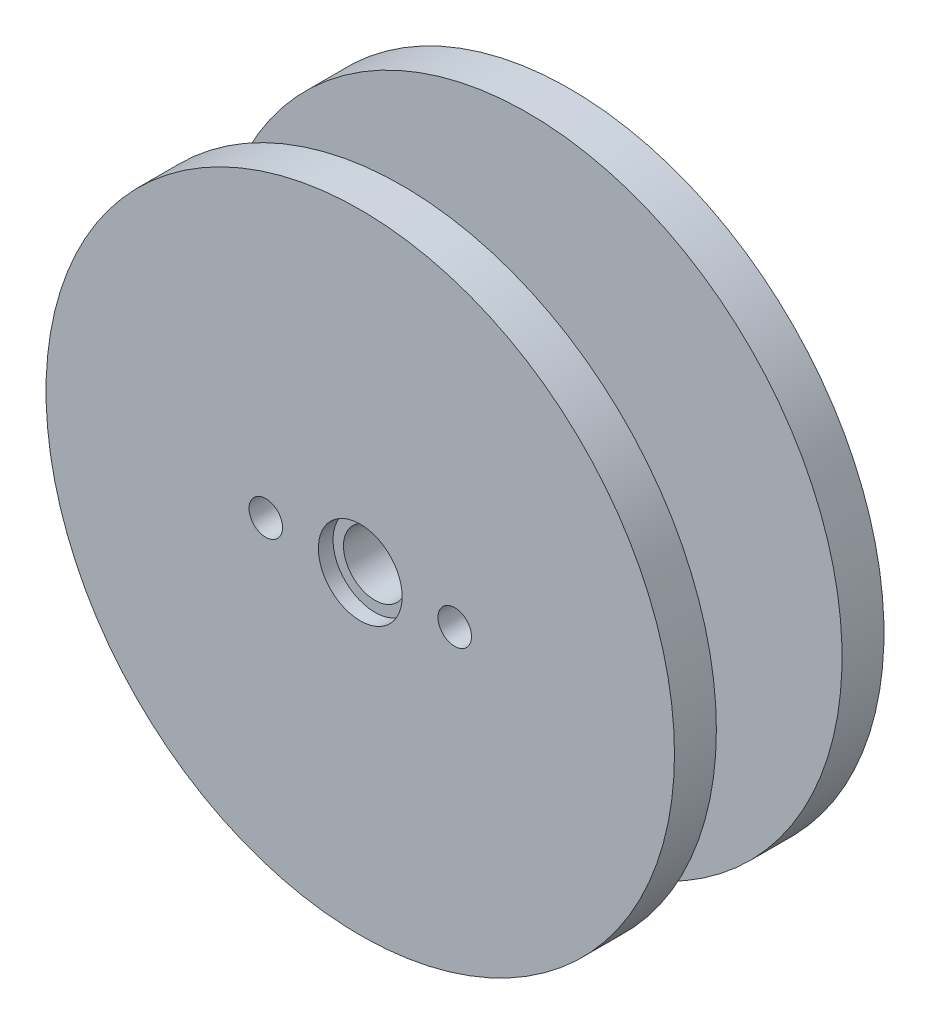
ISO-10303-21;
HEADER;
FILE_DESCRIPTION(('STEP AP214'),'2;1');
FILE_NAME('part.step','',(''),(''),'','','');
FILE_SCHEMA(('AUTOMOTIVE_DESIGN { 1 0 10303 214 1 1 1 1 }'));
ENDSEC;
DATA;
#1=APPLICATION_CONTEXT('core data for automotive mechanical design processes');
#2=APPLICATION_PROTOCOL_DEFINITION('international standard','automotive_design',2000,#1);
#3=PRODUCT_CONTEXT('',#1,'mechanical');
#4=PRODUCT('Part','Part','',(#3));
#5=PRODUCT_RELATED_PRODUCT_CATEGORY('part','',(#4));
#6=PRODUCT_DEFINITION_FORMATION('','',#4);
#7=PRODUCT_DEFINITION_CONTEXT('part definition',#1,'design');
#8=PRODUCT_DEFINITION('design','',#6,#7);
#9=PRODUCT_DEFINITION_SHAPE('','',#8);
#10=(LENGTH_UNIT() NAMED_UNIT(*) SI_UNIT(.MILLI.,.METRE.));
#11=(NAMED_UNIT(*) PLANE_ANGLE_UNIT() SI_UNIT($,.RADIAN.));
#12=(NAMED_UNIT(*) SI_UNIT($,.STERADIAN.) SOLID_ANGLE_UNIT());
#13=UNCERTAINTY_MEASURE_WITH_UNIT(LENGTH_MEASURE(1.E-05),#10,'distance_accuracy_value','');
#14=(GEOMETRIC_REPRESENTATION_CONTEXT(3) GLOBAL_UNCERTAINTY_ASSIGNED_CONTEXT((#13)) GLOBAL_UNIT_ASSIGNED_CONTEXT((#10,
#11,#12)) REPRESENTATION_CONTEXT('',''));
#15=CARTESIAN_POINT('',(0.,0.,0.));
#16=DIRECTION('',(0.,0.,1.));
#17=DIRECTION('',(1.,0.,0.));
#18=AXIS2_PLACEMENT_3D('',#15,#16,#17);
#19=CARTESIAN_POINT('',(0.,0.,8.));
#20=DIRECTION('',(0.,0.,-1.));
#21=DIRECTION('',(-1.,0.,0.));
#22=AXIS2_PLACEMENT_3D('',#19,#20,#21);
#23=CYLINDRICAL_SURFACE('',#22,1.5);
#24=CARTESIAN_POINT('',(0.,0.,-2.));
#25=DIRECTION('',(0.,0.,-1.));
#26=DIRECTION('',(-1.,0.,0.));
#27=AXIS2_PLACEMENT_3D('',#24,#25,#26);
#28=CIRCLE('',#27,1.5);
#29=CARTESIAN_POINT('',(-1.5,0.,-2.));
#30=VERTEX_POINT('',#29);
#31=EDGE_CURVE('E66',#30,#30,#28,.T.);
#32=ORIENTED_EDGE('',*,*,#31,.T.);
#33=EDGE_LOOP('',(#32));
#34=FACE_BOUND('',#33,.T.);
#35=CARTESIAN_POINT('',(0.,0.,7.3));
#36=DIRECTION('',(0.,0.,1.));
#37=DIRECTION('',(1.,0.,0.));
#38=AXIS2_PLACEMENT_3D('',#35,#36,#37);
#39=CIRCLE('',#38,1.5);
#40=CARTESIAN_POINT('',(1.5,0.,7.3));
#41=VERTEX_POINT('',#40);
#42=EDGE_CURVE('E43',#41,#41,#39,.F.);
#43=ORIENTED_EDGE('',*,*,#42,.F.);
#44=EDGE_LOOP('',(#43));
#45=FACE_BOUND('',#44,.T.);
#46=ADVANCED_FACE('F38',(#34,#45),#23,.F.);
#47=CARTESIAN_POINT('',(0.,0.,3.));
#48=DIRECTION('',(0.,0.,1.));
#49=DIRECTION('',(1.,0.,0.));
#50=AXIS2_PLACEMENT_3D('',#47,#48,#49);
#51=TOROIDAL_SURFACE('',#50,5.5,3.);
#52=CARTESIAN_POINT('',(3.84590634261577,-0.447005305401507,5.51971305273532));
#53=CARTESIAN_POINT('',(3.8736657957954,-0.488206800975002,5.54060192491901));
#54=CARTESIAN_POINT('',(3.90493997473341,-0.526352777900137,5.56298081347047));
#55=CARTESIAN_POINT('',(3.97361066421637,-0.596126887451473,5.60876043869469));
#56=CARTESIAN_POINT('',(4.01102750979954,-0.627732555291743,5.63216437337878));
#57=CARTESIAN_POINT('',(4.09114575943373,-0.683716747534394,5.6784516763839));
#58=CARTESIAN_POINT('',(4.13384019268729,-0.708104663772777,5.7013356851022));
#59=CARTESIAN_POINT('',(4.22364112865989,-0.748855362876252,5.74543973880093));
#60=CARTESIAN_POINT('',(4.27074222054837,-0.765227837589809,5.76666176713467));
#61=CARTESIAN_POINT('',(4.36735794436639,-0.788835080549227,5.80624577416201));
#62=CARTESIAN_POINT('',(4.41681749335596,-0.796221398309971,5.82465047462435));
#63=CARTESIAN_POINT('',(4.5172666641873,-0.801537289848154,5.85844466005841));
#64=CARTESIAN_POINT('',(4.5682555443175,-0.799471376486522,5.87383558026599));
#65=CARTESIAN_POINT('',(4.66469282239618,-0.786133156007755,5.89998092206338));
#66=CARTESIAN_POINT('',(4.7101879542234,-0.775796797946422,5.91104421286877));
#67=CARTESIAN_POINT('',(4.79916882584744,-0.747127520136588,5.93057884861724));
#68=CARTESIAN_POINT('',(4.84265532276102,-0.728797641049508,5.93905117705565));
#69=CARTESIAN_POINT('',(4.92348175134706,-0.685914554423775,5.95321014804157));
#70=CARTESIAN_POINT('',(4.96103451357555,-0.661806246675306,5.95903458385347));
#71=CARTESIAN_POINT('',(5.03174506827459,-0.607545338842571,5.96893431921367));
#72=CARTESIAN_POINT('',(5.06490325034442,-0.577393275160692,5.97300977388881));
#73=CARTESIAN_POINT('',(5.12545589320538,-0.512247345021257,5.97973524598194));
#74=CARTESIAN_POINT('',(5.15290818354631,-0.477308688041868,5.98240003680366));
#75=CARTESIAN_POINT('',(5.20167895474551,-0.403328247570261,5.9867118679521));
#76=CARTESIAN_POINT('',(5.22299724570435,-0.364286337098531,5.98835887677162));
#77=CARTESIAN_POINT('',(5.25900348307997,-0.282921492316378,5.99093528820772));
#78=CARTESIAN_POINT('',(5.27364619188831,-0.240578384652845,5.99185982418838));
#79=CARTESIAN_POINT('',(5.29567106874993,-0.154036101922157,5.99318832147928));
#80=CARTESIAN_POINT('',(5.30305302883622,-0.109836873728622,5.99359226787857));
#81=CARTESIAN_POINT('',(5.31036401942534,-0.0206080905449987,5.99399261612088));
#82=CARTESIAN_POINT('',(5.31025677885737,0.0244244492216642,5.99398703456575));
#83=CARTESIAN_POINT('',(5.30250182704995,0.113834042614353,5.99356177554952));
#84=CARTESIAN_POINT('',(5.294854009545,0.158211086993873,5.99314209225269));
#85=CARTESIAN_POINT('',(5.2722273647608,0.245087076993612,5.99177088723134));
#86=CARTESIAN_POINT('',(5.25724239408749,0.287584416168563,5.99081891973058));
#87=CARTESIAN_POINT('',(5.22037314074514,0.369448300672347,5.98816032004576));
#88=CARTESIAN_POINT('',(5.19848890417183,0.408814866916457,5.98645369290376));
#89=CARTESIAN_POINT('',(5.14852822322437,0.48319904717897,5.98198513651752));
#90=CARTESIAN_POINT('',(5.12046653098194,0.518226716468673,5.97922571010121));
#91=CARTESIAN_POINT('',(5.05897451706233,0.583036597984468,5.97229781042599));
#92=CARTESIAN_POINT('',(5.02554456741038,0.612819173400795,5.96812943478646));
#93=CARTESIAN_POINT('',(4.95460803053221,0.666122724410597,5.95805967229898));
#94=CARTESIAN_POINT('',(4.91713059986848,0.689684759038145,5.9521702190737));
#95=CARTESIAN_POINT('',(4.83911468194933,0.730206406578141,5.93834593502795));
#96=CARTESIAN_POINT('',(4.7985764747645,0.747166622705471,5.93041129118881));
#97=CARTESIAN_POINT('',(4.71585044593173,0.774115016239555,5.91232256270147));
#98=CARTESIAN_POINT('',(4.67366741578304,0.784122049144866,5.90217457923738));
#99=CARTESIAN_POINT('',(4.58884671101613,0.797198859420019,5.87959664166633));
#100=CARTESIAN_POINT('',(4.54620899570448,0.800268010537971,5.86716648166688));
#101=CARTESIAN_POINT('',(4.46058352480771,0.799687740500946,5.83978902872421));
#102=CARTESIAN_POINT('',(4.41761546797994,0.79586164754522,5.82478471645772));
#103=CARTESIAN_POINT('',(4.33356389362078,0.781607688319427,5.79279991739771));
#104=CARTESIAN_POINT('',(4.29248078349526,0.771178401999713,5.77581900616799));
#105=CARTESIAN_POINT('',(4.21012159194872,0.743287873175992,5.7390272230306));
#106=CARTESIAN_POINT('',(4.16905428461722,0.725365169122906,5.71910002670496));
#107=CARTESIAN_POINT('',(4.09082097306606,0.683222492861921,5.67821319994903));
#108=CARTESIAN_POINT('',(4.05365866798119,0.658996623949805,5.65725261773307));
#109=CARTESIAN_POINT('',(3.98046132356736,0.602167743110023,5.61318209891638));
#110=CARTESIAN_POINT('',(3.94488572932509,0.568979895461213,5.59006099431035));
#111=CARTESIAN_POINT('',(3.87993465202862,0.496171698215627,5.54523782055409));
#112=CARTESIAN_POINT('',(3.8505555591567,0.4565551176601,5.52353493032727));
#113=CARTESIAN_POINT('',(3.80517305169282,0.381497815482867,5.48841855774988));
#114=CARTESIAN_POINT('',(3.78765103914619,0.347322576068484,5.47426367876685));
#115=CARTESIAN_POINT('',(3.75742243243851,0.275812293621728,5.44918265271952));
#116=CARTESIAN_POINT('',(3.74470727187317,0.238483018174353,5.43825076960768));
#117=CARTESIAN_POINT('',(3.72633804884,0.167310601356769,5.4222090585503));
#118=CARTESIAN_POINT('',(3.71989778932614,0.133816765135987,5.41646162870088));
#119=CARTESIAN_POINT('',(3.71135328133478,0.0658535142941662,5.40880173737713));
#120=CARTESIAN_POINT('',(3.70924565825473,0.0313848801542608,5.40688629127968));
#121=CARTESIAN_POINT('',(3.70950958886731,-0.0375513562851095,5.40712496494974));
#122=CARTESIAN_POINT('',(3.71188530138707,-0.0720189279383176,5.40928286322924));
#123=CARTESIAN_POINT('',(3.72095900498777,-0.139934323434069,5.41740820443054));
#124=CARTESIAN_POINT('',(3.72766130563741,-0.173381095666829,5.42337944563115));
#125=CARTESIAN_POINT('',(3.74501955081187,-0.238554264204807,5.43850589277525));
#126=CARTESIAN_POINT('',(3.75568679713242,-0.270275442627187,5.44767019559324));
#127=CARTESIAN_POINT('',(3.78051049916783,-0.331436411570226,5.46838927771473));
#128=CARTESIAN_POINT('',(3.79466386903667,-0.360878189639608,5.47994194144422));
#129=CARTESIAN_POINT('',(3.82145226665705,-0.409008611633465,5.50107398233102));
#130=CARTESIAN_POINT('',(3.83331790889555,-0.428321137062714,5.51024030911631));
#131=CARTESIAN_POINT('',(3.84590634261577,-0.447005305401507,5.51971305273532));
#132=B_SPLINE_CURVE_WITH_KNOTS('',3,(#52,#53,#54,#55,#56,#57,#58,#59,#60,#61,#62,#63,#64,#65,
#66,#67,#68,#69,#70,#71,#72,#73,#74,#75,#76,#77,#78,#79,#80,#81,#82,#83,#84,#85,#86,#87,#88,#89,
#90,#91,#92,#93,#94,#95,#96,#97,#98,#99,#100,#101,#102,#103,#104,#105,#106,#107,#108,#109,#110,
#111,#112,#113,#114,#115,#116,#117,#118,#119,#120,#121,#122,#123,#124,#125,#126,#127,#128,#129,
#130,#131),.UNSPECIFIED.,.T.,.F.,(4,2,2,2,2,2,2,2,2,2,2,2,2,2,2,2,2,2,2,2,2,2,2,2,2,2,2,2,2,2,2,
2,2,2,2,2,2,2,2,4),(0.,0.161600596043769,0.323747370555806,0.485682220371078,0.647420780524826,
0.806392061163768,0.96528745068355,1.10838167364714,1.25142151230716,1.3857854787599,
1.52013752526328,1.6530532272666,1.78597304369845,1.91978068057509,2.05359214994371,
2.18805172857219,2.32251320209768,2.45708745316039,2.59166080511783,2.72591620837891,
2.86016231162732,2.99349881195332,3.12682312632603,3.25978446850146,3.39275781202972,
3.52918680326382,3.6656451442028,3.81215686473554,3.95880614509003,4.1196881468866,
4.28047616522288,4.40282959756593,4.52496394138022,4.62827635933461,4.73150827880897,
4.83483600524232,4.93826681208395,5.04199473068361,5.14563115933597,5.21891424525564),.UNSPECIFIED.);
#133=CARTESIAN_POINT('',(3.84590634261577,-0.447005305401507,5.51971305273532));
#134=VERTEX_POINT('',#133);
#135=EDGE_CURVE('E75',#134,#134,#132,.T.);
#136=ORIENTED_EDGE('',*,*,#135,.T.);
#137=EDGE_LOOP('',(#136));
#138=FACE_BOUND('',#137,.T.);
#139=CARTESIAN_POINT('',(-5.06228618167669,-0.578174330453134,5.9725635555975));
#140=CARTESIAN_POINT('',(-5.03030500488935,-0.608752404973662,5.96870893865694));
#141=CARTESIAN_POINT('',(-4.99579362410612,-0.636659657368072,5.96410535080206));
#142=CARTESIAN_POINT('',(-4.92278200037975,-0.686330111290471,5.95305605506126));
#143=CARTESIAN_POINT('',(-4.88427333513377,-0.708079964683237,5.94660640515561));
#144=CARTESIAN_POINT('',(-4.80459349550698,-0.744825588460931,5.93159618420919));
#145=CARTESIAN_POINT('',(-4.7634255121407,-0.759829287751273,5.92303810966462));
#146=CARTESIAN_POINT('',(-4.67972684535911,-0.78285571133062,5.90365311765589));
#147=CARTESIAN_POINT('',(-4.63719683475282,-0.790881828867673,5.8928273061907));
#148=CARTESIAN_POINT('',(-4.55163462060293,-0.800051926965312,5.86878560900146));
#149=CARTESIAN_POINT('',(-4.50860151586213,-0.801129092851337,5.85554777426391));
#150=CARTESIAN_POINT('',(-4.42363076209671,-0.796530393154323,5.82692390376569));
#151=CARTESIAN_POINT('',(-4.38169341922979,-0.790852660431337,5.81153727508884));
#152=CARTESIAN_POINT('',(-4.29759489325126,-0.772725253678213,5.7780298084748));
#153=CARTESIAN_POINT('',(-4.25555472311551,-0.759911381130719,5.75980365303739));
#154=CARTESIAN_POINT('',(-4.17467428365921,-0.727922901849148,5.72188509079244));
#155=CARTESIAN_POINT('',(-4.13583582963184,-0.708744717255481,5.70219186407392));
#156=CARTESIAN_POINT('',(-4.05846086925881,-0.662497430798277,5.66012383826044));
#157=CARTESIAN_POINT('',(-4.02031307505196,-0.63484657822345,5.63767335540682));
#158=CARTESIAN_POINT('',(-3.94932099486244,-0.573197167237218,5.59303905268779));
#159=CARTESIAN_POINT('',(-3.91647859629708,-0.539196359036044,5.57085533030986));
#160=CARTESIAN_POINT('',(-3.86048492434741,-0.469771547302976,5.53090361827071));
#161=CARTESIAN_POINT('',(-3.83664008763688,-0.435027661015909,5.51292713480073));
#162=CARTESIAN_POINT('',(-3.79430265281812,-0.361219439878678,5.47975689479346));
#163=CARTESIAN_POINT('',(-3.77580154359225,-0.322162113896519,5.46455872748172));
#164=CARTESIAN_POINT('',(-3.74826308210462,-0.248818722116708,5.44133470198051));
#165=CARTESIAN_POINT('',(-3.73805617652488,-0.215240026643889,5.43247380896978));
#166=CARTESIAN_POINT('',(-3.7220713461152,-0.146307570385357,5.41842462207925));
#167=CARTESIAN_POINT('',(-3.71628843248698,-0.110955857074749,5.41323219189494));
#168=CARTESIAN_POINT('',(-3.70951973345738,-0.03923559456745,5.40714193328157));
#169=CARTESIAN_POINT('',(-3.70855787783206,-0.00286287243102346,5.40626552822484));
#170=CARTESIAN_POINT('',(-3.71157407329029,0.0695078185921197,5.40899017211841));
#171=CARTESIAN_POINT('',(-3.71555312756685,0.105505709877265,5.41259213034732));
#172=CARTESIAN_POINT('',(-3.72771058883791,0.173545757594184,5.42339741122221));
#173=CARTESIAN_POINT('',(-3.73557741786207,0.205688847444054,5.43033260640786));
#174=CARTESIAN_POINT('',(-3.75492521281088,0.268104632378489,5.44698981948681));
#175=CARTESIAN_POINT('',(-3.7664088059629,0.298375948618029,5.45671386274658));
#176=CARTESIAN_POINT('',(-3.79828092777594,0.369397538980454,5.4829102341097));
#177=CARTESIAN_POINT('',(-3.82037038373876,0.408981922926679,5.50047844954565));
#178=CARTESIAN_POINT('',(-3.87018671674688,0.483162273240104,5.53800232042236));
#179=CARTESIAN_POINT('',(-3.89792266927207,0.517750053723196,5.55796179775715));
#180=CARTESIAN_POINT('',(-3.95880171855604,0.582119156957181,5.59912809598338));
#181=CARTESIAN_POINT('',(-3.99202040929109,0.611819669650258,5.62034923885603));
#182=CARTESIAN_POINT('',(-4.06297608479665,0.665361590007413,5.6625960004649));
#183=CARTESIAN_POINT('',(-4.10071220980098,0.689204109946879,5.6836216555884));
#184=CARTESIAN_POINT('',(-4.18471177870381,0.732860887846886,5.72694017260616));
#185=CARTESIAN_POINT('',(-4.2314567330724,0.751892555377657,5.74909918750791));
#186=CARTESIAN_POINT('',(-4.32868916830052,0.780976770951903,5.7910277710986));
#187=CARTESIAN_POINT('',(-4.37917572079463,0.791031538319655,5.81079792932966));
#188=CARTESIAN_POINT('',(-4.47867971311452,0.800862907958791,5.84597366643121));
#189=CARTESIAN_POINT('',(-4.52755742184901,0.801302017175522,5.8615864932043));
#190=CARTESIAN_POINT('',(-4.62540727709802,0.793058243187125,5.88981293636591));
#191=CARTESIAN_POINT('',(-4.67437934044746,0.784381354175199,5.90242851689928));
#192=CARTESIAN_POINT('',(-4.76599096593649,0.759073140680511,5.92361940285686));
#193=CARTESIAN_POINT('',(-4.80879563858762,0.743257494786835,5.93246149554266));
#194=CARTESIAN_POINT('',(-4.89141048848561,0.704364176847662,5.94786621045081));
#195=CARTESIAN_POINT('',(-4.9312213378526,0.681288140843013,5.95442934550841));
#196=CARTESIAN_POINT('',(-5.0049888188098,0.629535198682406,5.96537701298052));
#197=CARTESIAN_POINT('',(-5.03911387866926,0.601113626034073,5.96983693324609));
#198=CARTESIAN_POINT('',(-5.10226855888959,0.538922124256695,5.97729576815299));
#199=CARTESIAN_POINT('',(-5.1312983241045,0.505152347223582,5.98029472433234));
#200=CARTESIAN_POINT('',(-5.18336843682701,0.4332412542951,5.98518022629812));
#201=CARTESIAN_POINT('',(-5.20641291226416,0.395102977562005,5.98706753990624));
#202=CARTESIAN_POINT('',(-5.24586888170413,0.315507725717116,5.99004324232946));
#203=CARTESIAN_POINT('',(-5.26228006251573,0.274050594016169,5.99113159342349));
#204=CARTESIAN_POINT('',(-5.28809169350862,0.188674562583849,5.99275110810765));
#205=CARTESIAN_POINT('',(-5.29744134272203,0.144740223120218,5.99327824519047));
#206=CARTESIAN_POINT('',(-5.3086685270725,0.0559276075666258,5.99390325303014));
#207=CARTESIAN_POINT('',(-5.31054656575625,0.0110493952935946,5.99400115271535));
#208=CARTESIAN_POINT('',(-5.30677352707496,-0.0785213302615419,5.99379644947503));
#209=CARTESIAN_POINT('',(-5.30110024152008,-0.123212906316586,5.99349266522794));
#210=CARTESIAN_POINT('',(-5.28234131243765,-0.211031878645072,5.9923946826854));
#211=CARTESIAN_POINT('',(-5.26925189169272,-0.25415846591237,5.99160023446431));
#212=CARTESIAN_POINT('',(-5.23603197924498,-0.337616259646348,5.98932419687911));
#213=CARTESIAN_POINT('',(-5.21589688162421,-0.37794561678557,5.98784215781431));
#214=CARTESIAN_POINT('',(-5.16920871202613,-0.454553204881142,5.98390503877159));
#215=CARTESIAN_POINT('',(-5.1426704970646,-0.490840533649168,5.98145220299632));
#216=CARTESIAN_POINT('',(-5.09716124277091,-0.543247096914741,5.97662894434535));
#217=CARTESIAN_POINT('',(-5.08011697040832,-0.561125827509628,5.97471265913943));
#218=CARTESIAN_POINT('',(-5.06228618167669,-0.578174330453134,5.9725635555975));
#219=B_SPLINE_CURVE_WITH_KNOTS('',3,(#139,#140,#141,#142,#143,#144,#145,#146,#147,#148,#149,
#150,#151,#152,#153,#154,#155,#156,#157,#158,#159,#160,#161,#162,#163,#164,#165,#166,#167,#168,
#169,#170,#171,#172,#173,#174,#175,#176,#177,#178,#179,#180,#181,#182,#183,#184,#185,#186,#187,
#188,#189,#190,#191,#192,#193,#194,#195,#196,#197,#198,#199,#200,#201,#202,#203,#204,#205,#206,
#207,#208,#209,#210,#211,#212,#213,#214,#215,#216,#217,#218),.UNSPECIFIED.,.T.,.F.,(4,2,2,2,2,2,
2,2,2,2,2,2,2,2,2,2,2,2,2,2,2,2,2,2,2,2,2,2,2,2,2,2,2,2,2,2,2,2,2,4),(0.,0.133168340433744,
0.266623193156662,0.399920780761347,0.53315350847354,0.667665392931658,0.802214466826629,
0.94435916750027,1.08658391418243,1.2424950096937,1.39846144967461,1.53539325514699,
1.67210574707841,1.78026307597088,1.88829825868298,1.99686915683437,2.10546210262069,
2.2064963432202,2.30760414530058,2.45266926267769,2.59796940715935,2.74547217778162,
2.89294691991066,3.05744356364359,3.22189952823769,3.37498612110245,3.5279721153699,
3.66671650824189,3.80542965911242,3.93869926802492,4.07196508760455,4.20513875099304,
4.33831870144606,4.47244786031644,4.60656797944388,4.74108341414206,4.87566742247964,
5.01033957629456,5.14470220838103,5.21894889917062),.UNSPECIFIED.);
#220=CARTESIAN_POINT('',(-5.06228618167669,-0.578174330453134,5.9725635555975));
#221=VERTEX_POINT('',#220);
#222=EDGE_CURVE('E84',#221,#221,#219,.T.);
#223=ORIENTED_EDGE('',*,*,#222,.T.);
#224=EDGE_LOOP('',(#223));
#225=FACE_BOUND('',#224,.T.);
#226=CARTESIAN_POINT('',(0.,0.,6.));
#227=DIRECTION('',(0.,0.,1.));
#228=DIRECTION('',(1.,0.,0.));
#229=AXIS2_PLACEMENT_3D('',#226,#227,#228);
#230=CIRCLE('',#229,5.5);
#231=CARTESIAN_POINT('',(5.5,0.,6.));
#232=VERTEX_POINT('',#231);
#233=EDGE_CURVE('E10',#232,#232,#230,.T.);
#234=ORIENTED_EDGE('',*,*,#233,.F.);
#235=EDGE_LOOP('',(#234));
#236=FACE_BOUND('',#235,.T.);
#237=CARTESIAN_POINT('',(0.,0.,3.));
#238=DIRECTION('',(0.,0.,-1.));
#239=DIRECTION('',(-1.,0.,0.));
#240=AXIS2_PLACEMENT_3D('',#237,#238,#239);
#241=CIRCLE('',#240,2.5);
#242=CARTESIAN_POINT('',(-2.5,0.,3.));
#243=VERTEX_POINT('',#242);
#244=EDGE_CURVE('E47',#243,#243,#241,.F.);
#245=ORIENTED_EDGE('',*,*,#244,.T.);
#246=EDGE_LOOP('',(#245));
#247=FACE_BOUND('',#246,.T.);
#248=ADVANCED_FACE('F40',(#138,#225,#236,#247),#51,.F.);
#249=CARTESIAN_POINT('',(0.,0.,3.));
#250=DIRECTION('',(0.,0.,-1.));
#251=DIRECTION('',(-1.,0.,0.));
#252=AXIS2_PLACEMENT_3D('',#249,#250,#251);
#253=TOROIDAL_SURFACE('',#252,5.5,3.);
#254=CARTESIAN_POINT('',(0.,0.,0.));
#255=DIRECTION('',(0.,0.,-1.));
#256=DIRECTION('',(-1.,0.,0.));
#257=AXIS2_PLACEMENT_3D('',#254,#255,#256);
#258=CIRCLE('',#257,5.5);
#259=CARTESIAN_POINT('',(-5.5,0.,0.));
#260=VERTEX_POINT('',#259);
#261=EDGE_CURVE('E51',#260,#260,#258,.T.);
#262=ORIENTED_EDGE('',*,*,#261,.F.);
#263=EDGE_LOOP('',(#262));
#264=FACE_BOUND('',#263,.T.);
#265=ORIENTED_EDGE('',*,*,#244,.F.);
#266=EDGE_LOOP('',(#265));
#267=FACE_BOUND('',#266,.T.);
#268=ADVANCED_FACE('F131',(#264,#267),#253,.F.);
#269=CARTESIAN_POINT('',(0.,0.,-2.));
#270=DIRECTION('',(0.,0.,1.));
#271=DIRECTION('',(1.,0.,0.));
#272=AXIS2_PLACEMENT_3D('',#269,#270,#271);
#273=CYLINDRICAL_SURFACE('',#272,15.);
#274=CARTESIAN_POINT('',(0.,0.,-2.));
#275=DIRECTION('',(0.,0.,-1.));
#276=DIRECTION('',(-1.,0.,0.));
#277=AXIS2_PLACEMENT_3D('',#274,#275,#276);
#278=CIRCLE('',#277,15.);
#279=CARTESIAN_POINT('',(-15.,0.,-2.));
#280=VERTEX_POINT('',#279);
#281=EDGE_CURVE('E56',#280,#280,#278,.T.);
#282=ORIENTED_EDGE('',*,*,#281,.F.);
#283=EDGE_LOOP('',(#282));
#284=FACE_BOUND('',#283,.T.);
#285=CARTESIAN_POINT('',(0.,0.,0.));
#286=DIRECTION('',(0.,0.,-1.));
#287=DIRECTION('',(-1.,0.,0.));
#288=AXIS2_PLACEMENT_3D('',#285,#286,#287);
#289=CIRCLE('',#288,15.);
#290=CARTESIAN_POINT('',(-15.,0.,0.));
#291=VERTEX_POINT('',#290);
#292=EDGE_CURVE('E57',#291,#291,#289,.T.);
#293=ORIENTED_EDGE('',*,*,#292,.T.);
#294=EDGE_LOOP('',(#293));
#295=FACE_BOUND('',#294,.T.);
#296=ADVANCED_FACE('F125',(#284,#295),#273,.T.);
#297=CARTESIAN_POINT('',(0.,0.,-2.));
#298=DIRECTION('',(0.,0.,-1.));
#299=DIRECTION('',(-1.,0.,0.));
#300=AXIS2_PLACEMENT_3D('',#297,#298,#299);
#301=PLANE('',#300);
#302=ORIENTED_EDGE('',*,*,#31,.F.);
#303=EDGE_LOOP('',(#302));
#304=FACE_BOUND('',#303,.T.);
#305=ORIENTED_EDGE('',*,*,#281,.T.);
#306=EDGE_LOOP('',(#305));
#307=FACE_BOUND('',#306,.T.);
#308=ADVANCED_FACE('F122',(#304,#307),#301,.T.);
#309=CARTESIAN_POINT('',(0.,0.,0.));
#310=DIRECTION('',(0.,0.,-1.));
#311=DIRECTION('',(-1.,0.,0.));
#312=AXIS2_PLACEMENT_3D('',#309,#310,#311);
#313=PLANE('',#312);
#314=ORIENTED_EDGE('',*,*,#261,.T.);
#315=EDGE_LOOP('',(#314));
#316=FACE_BOUND('',#315,.T.);
#317=ORIENTED_EDGE('',*,*,#292,.F.);
#318=EDGE_LOOP('',(#317));
#319=FACE_BOUND('',#318,.T.);
#320=ADVANCED_FACE('F120',(#316,#319),#313,.F.);
#321=CARTESIAN_POINT('',(0.,0.,8.));
#322=DIRECTION('',(0.,0.,-1.));
#323=DIRECTION('',(-1.,0.,0.));
#324=AXIS2_PLACEMENT_3D('',#321,#322,#323);
#325=CYLINDRICAL_SURFACE('',#324,15.);
#326=CARTESIAN_POINT('',(0.,0.,8.));
#327=DIRECTION('',(0.,0.,1.));
#328=DIRECTION('',(1.,0.,0.));
#329=AXIS2_PLACEMENT_3D('',#326,#327,#328);
#330=CIRCLE('',#329,15.);
#331=CARTESIAN_POINT('',(15.,0.,8.));
#332=VERTEX_POINT('',#331);
#333=EDGE_CURVE('E60',#332,#332,#330,.T.);
#334=ORIENTED_EDGE('',*,*,#333,.F.);
#335=EDGE_LOOP('',(#334));
#336=FACE_BOUND('',#335,.T.);
#337=CARTESIAN_POINT('',(0.,0.,6.));
#338=DIRECTION('',(0.,0.,1.));
#339=DIRECTION('',(1.,0.,0.));
#340=AXIS2_PLACEMENT_3D('',#337,#338,#339);
#341=CIRCLE('',#340,15.);
#342=CARTESIAN_POINT('',(15.,0.,6.));
#343=VERTEX_POINT('',#342);
#344=EDGE_CURVE('E63',#343,#343,#341,.T.);
#345=ORIENTED_EDGE('',*,*,#344,.T.);
#346=EDGE_LOOP('',(#345));
#347=FACE_BOUND('',#346,.T.);
#348=ADVANCED_FACE('F114',(#336,#347),#325,.T.);
#349=CARTESIAN_POINT('',(0.,0.,8.));
#350=DIRECTION('',(0.,0.,1.));
#351=DIRECTION('',(1.,0.,0.));
#352=AXIS2_PLACEMENT_3D('',#349,#350,#351);
#353=PLANE('',#352);
#354=CARTESIAN_POINT('',(4.50937168231308,0.,8.));
#355=DIRECTION('',(0.,0.,1.));
#356=DIRECTION('',(1.,0.,0.));
#357=AXIS2_PLACEMENT_3D('',#354,#355,#356);
#358=CIRCLE('',#357,0.8);
#359=CARTESIAN_POINT('',(5.30937168231309,0.,8.));
#360=VERTEX_POINT('',#359);
#361=EDGE_CURVE('E154',#360,#360,#358,.T.);
#362=ORIENTED_EDGE('',*,*,#361,.F.);
#363=EDGE_LOOP('',(#362));
#364=FACE_BOUND('',#363,.T.);
#365=CARTESIAN_POINT('',(-4.50937168231308,0.,8.));
#366=DIRECTION('',(0.,0.,1.));
#367=DIRECTION('',(1.,0.,0.));
#368=AXIS2_PLACEMENT_3D('',#365,#366,#367);
#369=CIRCLE('',#368,0.8);
#370=CARTESIAN_POINT('',(-3.70937168231309,0.,8.));
#371=VERTEX_POINT('',#370);
#372=EDGE_CURVE('E156',#371,#371,#369,.T.);
#373=ORIENTED_EDGE('',*,*,#372,.F.);
#374=EDGE_LOOP('',(#373));
#375=FACE_BOUND('',#374,.T.);
#376=CARTESIAN_POINT('',(0.,0.,8.));
#377=DIRECTION('',(0.,0.,1.));
#378=DIRECTION('',(1.,0.,0.));
#379=AXIS2_PLACEMENT_3D('',#376,#377,#378);
#380=CIRCLE('',#379,1.99937168231309);
#381=CARTESIAN_POINT('',(1.99937168231309,0.,8.));
#382=VERTEX_POINT('',#381);
#383=EDGE_CURVE('E71',#382,#382,#380,.T.);
#384=ORIENTED_EDGE('',*,*,#383,.F.);
#385=EDGE_LOOP('',(#384));
#386=FACE_BOUND('',#385,.T.);
#387=ORIENTED_EDGE('',*,*,#333,.T.);
#388=EDGE_LOOP('',(#387));
#389=FACE_BOUND('',#388,.T.);
#390=ADVANCED_FACE('F111',(#364,#375,#386,#389),#353,.T.);
#391=CARTESIAN_POINT('',(0.,0.,6.));
#392=DIRECTION('',(0.,0.,1.));
#393=DIRECTION('',(1.,0.,0.));
#394=AXIS2_PLACEMENT_3D('',#391,#392,#393);
#395=PLANE('',#394);
#396=ORIENTED_EDGE('',*,*,#233,.T.);
#397=EDGE_LOOP('',(#396));
#398=FACE_BOUND('',#397,.T.);
#399=ORIENTED_EDGE('',*,*,#344,.F.);
#400=EDGE_LOOP('',(#399));
#401=FACE_BOUND('',#400,.T.);
#402=ADVANCED_FACE('F103',(#398,#401),#395,.F.);
#403=CARTESIAN_POINT('',(0.,0.,7.3));
#404=DIRECTION('',(0.,0.,1.));
#405=DIRECTION('',(1.,0.,0.));
#406=AXIS2_PLACEMENT_3D('',#403,#404,#405);
#407=PLANE('',#406);
#408=CARTESIAN_POINT('',(0.,0.,7.3));
#409=DIRECTION('',(0.,0.,1.));
#410=DIRECTION('',(1.,0.,0.));
#411=AXIS2_PLACEMENT_3D('',#408,#409,#410);
#412=CIRCLE('',#411,1.99937168231309);
#413=CARTESIAN_POINT('',(1.99937168231309,0.,7.3));
#414=VERTEX_POINT('',#413);
#415=EDGE_CURVE('E74',#414,#414,#412,.T.);
#416=ORIENTED_EDGE('',*,*,#415,.T.);
#417=EDGE_LOOP('',(#416));
#418=FACE_BOUND('',#417,.T.);
#419=ORIENTED_EDGE('',*,*,#42,.T.);
#420=EDGE_LOOP('',(#419));
#421=FACE_BOUND('',#420,.T.);
#422=ADVANCED_FACE('F100',(#418,#421),#407,.T.);
#423=CARTESIAN_POINT('',(0.,0.,7.3));
#424=DIRECTION('',(0.,0.,1.));
#425=DIRECTION('',(1.,0.,0.));
#426=AXIS2_PLACEMENT_3D('',#423,#424,#425);
#427=CYLINDRICAL_SURFACE('',#426,1.99937168231309);
#428=ORIENTED_EDGE('',*,*,#415,.F.);
#429=EDGE_LOOP('',(#428));
#430=FACE_BOUND('',#429,.T.);
#431=ORIENTED_EDGE('',*,*,#383,.T.);
#432=EDGE_LOOP('',(#431));
#433=FACE_BOUND('',#432,.T.);
#434=ADVANCED_FACE('F98',(#430,#433),#427,.F.);
#435=CARTESIAN_POINT('',(-4.50937168231308,0.,5.));
#436=DIRECTION('',(0.,0.,1.));
#437=DIRECTION('',(1.,0.,0.));
#438=AXIS2_PLACEMENT_3D('',#435,#436,#437);
#439=CYLINDRICAL_SURFACE('',#438,0.8);
#440=ORIENTED_EDGE('',*,*,#372,.T.);
#441=EDGE_LOOP('',(#440));
#442=FACE_BOUND('',#441,.T.);
#443=ORIENTED_EDGE('',*,*,#222,.F.);
#444=EDGE_LOOP('',(#443));
#445=FACE_BOUND('',#444,.T.);
#446=ADVANCED_FACE('F93',(#442,#445),#439,.F.);
#447=CARTESIAN_POINT('',(4.50937168231308,0.,5.));
#448=DIRECTION('',(0.,0.,1.));
#449=DIRECTION('',(1.,0.,0.));
#450=AXIS2_PLACEMENT_3D('',#447,#448,#449);
#451=CYLINDRICAL_SURFACE('',#450,0.8);
#452=ORIENTED_EDGE('',*,*,#361,.T.);
#453=EDGE_LOOP('',(#452));
#454=FACE_BOUND('',#453,.T.);
#455=ORIENTED_EDGE('',*,*,#135,.F.);
#456=EDGE_LOOP('',(#455));
#457=FACE_BOUND('',#456,.T.);
#458=ADVANCED_FACE('F90',(#454,#457),#451,.F.);
#459=CLOSED_SHELL('',(#46,#248,#268,#296,#308,#320,#348,#390,#402,#422,#434,#446,#458));
#460=MANIFOLD_SOLID_BREP('B2',#459);
#461=ADVANCED_BREP_SHAPE_REPRESENTATION('',(#18,#460),#14);
#462=SHAPE_DEFINITION_REPRESENTATION(#9,#461);
ENDSEC;
END-ISO-10303-21;
